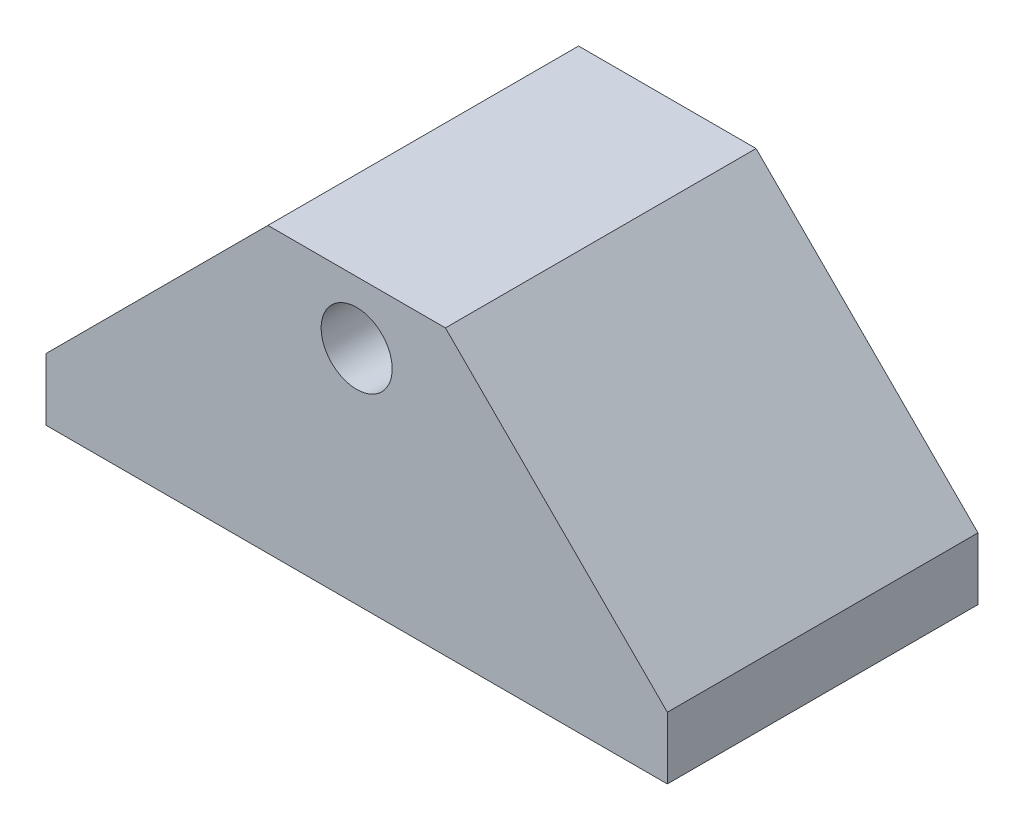
ISO-10303-21;
HEADER;
FILE_DESCRIPTION(('STEP AP214'),'2;1');
FILE_NAME('part.step','',(''),(''),'','','');
FILE_SCHEMA(('AUTOMOTIVE_DESIGN { 1 0 10303 214 1 1 1 1 }'));
ENDSEC;
DATA;
#1=APPLICATION_CONTEXT('core data for automotive mechanical design processes');
#2=APPLICATION_PROTOCOL_DEFINITION('international standard','automotive_design',2000,#1);
#3=PRODUCT_CONTEXT('',#1,'mechanical');
#4=PRODUCT('Part','Part','',(#3));
#5=PRODUCT_RELATED_PRODUCT_CATEGORY('part','',(#4));
#6=PRODUCT_DEFINITION_FORMATION('','',#4);
#7=PRODUCT_DEFINITION_CONTEXT('part definition',#1,'design');
#8=PRODUCT_DEFINITION('design','',#6,#7);
#9=PRODUCT_DEFINITION_SHAPE('','',#8);
#10=(LENGTH_UNIT() NAMED_UNIT(*) SI_UNIT(.MILLI.,.METRE.));
#11=(NAMED_UNIT(*) PLANE_ANGLE_UNIT() SI_UNIT($,.RADIAN.));
#12=(NAMED_UNIT(*) SI_UNIT($,.STERADIAN.) SOLID_ANGLE_UNIT());
#13=UNCERTAINTY_MEASURE_WITH_UNIT(LENGTH_MEASURE(1.E-05),#10,'distance_accuracy_value','');
#14=(GEOMETRIC_REPRESENTATION_CONTEXT(3) GLOBAL_UNCERTAINTY_ASSIGNED_CONTEXT((#13)) GLOBAL_UNIT_ASSIGNED_CONTEXT((#10,
#11,#12)) REPRESENTATION_CONTEXT('',''));
#15=CARTESIAN_POINT('',(0.,0.,0.));
#16=DIRECTION('',(0.,0.,1.));
#17=DIRECTION('',(1.,0.,0.));
#18=AXIS2_PLACEMENT_3D('',#15,#16,#17);
#19=CARTESIAN_POINT('',(35.,32.,17.5));
#20=DIRECTION('',(-1.,0.,0.));
#21=DIRECTION('',(0.,0.,1.));
#22=AXIS2_PLACEMENT_3D('',#19,#20,#21);
#23=PLANE('',#22);
#24=DIRECTION('',(0.,-1.,0.));
#25=VECTOR('',#24,1.);
#26=CARTESIAN_POINT('',(35.,32.,-17.5));
#27=LINE('',#26,#25);
#28=CARTESIAN_POINT('',(35.,6.9999999999999,-17.5));
#29=VERTEX_POINT('',#28);
#30=CARTESIAN_POINT('',(35.,0.,-17.5));
#31=VERTEX_POINT('',#30);
#32=EDGE_CURVE('E87',#29,#31,#27,.T.);
#33=ORIENTED_EDGE('',*,*,#32,.F.);
#34=DIRECTION('',(0.,0.,1.));
#35=VECTOR('',#34,1.);
#36=CARTESIAN_POINT('',(35.,6.9999999999999,17.5));
#37=LINE('',#36,#35);
#38=CARTESIAN_POINT('',(35.,6.9999999999999,17.5));
#39=VERTEX_POINT('',#38);
#40=EDGE_CURVE('E58',#29,#39,#37,.T.);
#41=ORIENTED_EDGE('',*,*,#40,.T.);
#42=DIRECTION('',(0.,-1.,0.));
#43=VECTOR('',#42,1.);
#44=CARTESIAN_POINT('',(35.,32.,17.5));
#45=LINE('',#44,#43);
#46=CARTESIAN_POINT('',(35.,0.,17.5));
#47=VERTEX_POINT('',#46);
#48=EDGE_CURVE('E107',#39,#47,#45,.T.);
#49=ORIENTED_EDGE('',*,*,#48,.T.);
#50=DIRECTION('',(0.,0.,-1.));
#51=VECTOR('',#50,1.);
#52=CARTESIAN_POINT('',(35.,0.,17.5));
#53=LINE('',#52,#51);
#54=EDGE_CURVE('E103',#47,#31,#53,.T.);
#55=ORIENTED_EDGE('',*,*,#54,.T.);
#56=EDGE_LOOP('',(#33,#41,#49,#55));
#57=FACE_BOUND('',#56,.T.);
#58=ADVANCED_FACE('F34',(#57),#23,.F.);
#59=CARTESIAN_POINT('',(-35.,32.,-17.5));
#60=DIRECTION('',(0.,0.,1.));
#61=DIRECTION('',(1.,0.,0.));
#62=AXIS2_PLACEMENT_3D('',#59,#60,#61);
#63=PLANE('',#62);
#64=CARTESIAN_POINT('',(0.,25.,-17.5));
#65=DIRECTION('',(0.,0.,1.));
#66=DIRECTION('',(1.,0.,0.));
#67=AXIS2_PLACEMENT_3D('',#64,#65,#66);
#68=CIRCLE('',#67,4.);
#69=CARTESIAN_POINT('',(4.,25.,-17.5));
#70=VERTEX_POINT('',#69);
#71=EDGE_CURVE('E109',#70,#70,#68,.T.);
#72=ORIENTED_EDGE('',*,*,#71,.T.);
#73=EDGE_LOOP('',(#72));
#74=FACE_BOUND('',#73,.T.);
#75=DIRECTION('',(-1.,0.,0.));
#76=VECTOR('',#75,1.);
#77=CARTESIAN_POINT('',(-35.,32.,-17.5));
#78=LINE('',#77,#76);
#79=CARTESIAN_POINT('',(9.99999999999999,32.,-17.5));
#80=VERTEX_POINT('',#79);
#81=CARTESIAN_POINT('',(-9.99999999999999,32.,-17.5));
#82=VERTEX_POINT('',#81);
#83=EDGE_CURVE('E121',#80,#82,#78,.T.);
#84=ORIENTED_EDGE('',*,*,#83,.F.);
#85=DIRECTION('',(-0.707106781186546,0.707106781186549,0.));
#86=VECTOR('',#85,1.);
#87=CARTESIAN_POINT('',(9.99999999999999,32.,-17.5));
#88=LINE('',#87,#86);
#89=EDGE_CURVE('E94',#80,#29,#88,.F.);
#90=ORIENTED_EDGE('',*,*,#89,.T.);
#91=ORIENTED_EDGE('',*,*,#32,.T.);
#92=DIRECTION('',(-1.,0.,0.));
#93=VECTOR('',#92,1.);
#94=CARTESIAN_POINT('',(-35.,0.,-17.5));
#95=LINE('',#94,#93);
#96=CARTESIAN_POINT('',(-35.,0.,-17.5));
#97=VERTEX_POINT('',#96);
#98=EDGE_CURVE('E92',#31,#97,#95,.T.);
#99=ORIENTED_EDGE('',*,*,#98,.T.);
#100=DIRECTION('',(0.,-1.,0.));
#101=VECTOR('',#100,1.);
#102=CARTESIAN_POINT('',(-35.,32.,-17.5));
#103=LINE('',#102,#101);
#104=CARTESIAN_POINT('',(-35.,6.9999999999999,-17.5));
#105=VERTEX_POINT('',#104);
#106=EDGE_CURVE('E97',#105,#97,#103,.T.);
#107=ORIENTED_EDGE('',*,*,#106,.F.);
#108=DIRECTION('',(-0.707106781186546,-0.707106781186549,0.));
#109=VECTOR('',#108,1.);
#110=CARTESIAN_POINT('',(-9.99999999999999,32.,-17.5));
#111=LINE('',#110,#109);
#112=EDGE_CURVE('E131',#105,#82,#111,.F.);
#113=ORIENTED_EDGE('',*,*,#112,.T.);
#114=EDGE_LOOP('',(#84,#90,#91,#99,#107,#113));
#115=FACE_BOUND('',#114,.T.);
#116=ADVANCED_FACE('F90',(#74,#115),#63,.F.);
#117=CARTESIAN_POINT('',(-35.,32.,17.5));
#118=DIRECTION('',(1.,0.,0.));
#119=DIRECTION('',(0.,0.,-1.));
#120=AXIS2_PLACEMENT_3D('',#117,#118,#119);
#121=PLANE('',#120);
#122=DIRECTION('',(0.,-1.,0.));
#123=VECTOR('',#122,1.);
#124=CARTESIAN_POINT('',(-35.,32.,17.5));
#125=LINE('',#124,#123);
#126=CARTESIAN_POINT('',(-35.,6.9999999999999,17.5));
#127=VERTEX_POINT('',#126);
#128=CARTESIAN_POINT('',(-35.,0.,17.5));
#129=VERTEX_POINT('',#128);
#130=EDGE_CURVE('E123',#127,#129,#125,.T.);
#131=ORIENTED_EDGE('',*,*,#130,.F.);
#132=DIRECTION('',(0.,0.,-1.));
#133=VECTOR('',#132,1.);
#134=CARTESIAN_POINT('',(-35.,6.9999999999999,17.5));
#135=LINE('',#134,#133);
#136=EDGE_CURVE('E11',#127,#105,#135,.T.);
#137=ORIENTED_EDGE('',*,*,#136,.T.);
#138=ORIENTED_EDGE('',*,*,#106,.T.);
#139=DIRECTION('',(0.,0.,1.));
#140=VECTOR('',#139,1.);
#141=CARTESIAN_POINT('',(-35.,0.,17.5));
#142=LINE('',#141,#140);
#143=EDGE_CURVE('E105',#97,#129,#142,.T.);
#144=ORIENTED_EDGE('',*,*,#143,.T.);
#145=EDGE_LOOP('',(#131,#137,#138,#144));
#146=FACE_BOUND('',#145,.T.);
#147=ADVANCED_FACE('F160',(#146),#121,.F.);
#148=CARTESIAN_POINT('',(-35.,32.,17.5));
#149=DIRECTION('',(0.,0.,-1.));
#150=DIRECTION('',(-1.,0.,0.));
#151=AXIS2_PLACEMENT_3D('',#148,#149,#150);
#152=PLANE('',#151);
#153=CARTESIAN_POINT('',(0.,25.,17.5));
#154=DIRECTION('',(0.,0.,1.));
#155=DIRECTION('',(1.,0.,0.));
#156=AXIS2_PLACEMENT_3D('',#153,#154,#155);
#157=CIRCLE('',#156,4.);
#158=CARTESIAN_POINT('',(4.,25.,17.5));
#159=VERTEX_POINT('',#158);
#160=EDGE_CURVE('E112',#159,#159,#157,.T.);
#161=ORIENTED_EDGE('',*,*,#160,.F.);
#162=EDGE_LOOP('',(#161));
#163=FACE_BOUND('',#162,.T.);
#164=ORIENTED_EDGE('',*,*,#48,.F.);
#165=DIRECTION('',(0.707106781186546,-0.707106781186549,0.));
#166=VECTOR('',#165,1.);
#167=CARTESIAN_POINT('',(9.99999999999999,32.,17.5));
#168=LINE('',#167,#166);
#169=CARTESIAN_POINT('',(9.99999999999999,32.,17.5));
#170=VERTEX_POINT('',#169);
#171=EDGE_CURVE('E43',#39,#170,#168,.F.);
#172=ORIENTED_EDGE('',*,*,#171,.T.);
#173=DIRECTION('',(1.,0.,0.));
#174=VECTOR('',#173,1.);
#175=CARTESIAN_POINT('',(-35.,32.,17.5));
#176=LINE('',#175,#174);
#177=CARTESIAN_POINT('',(-9.99999999999999,32.,17.5));
#178=VERTEX_POINT('',#177);
#179=EDGE_CURVE('E115',#178,#170,#176,.T.);
#180=ORIENTED_EDGE('',*,*,#179,.F.);
#181=DIRECTION('',(0.707106781186546,0.707106781186549,0.));
#182=VECTOR('',#181,1.);
#183=CARTESIAN_POINT('',(-9.99999999999999,32.,17.5));
#184=LINE('',#183,#182);
#185=EDGE_CURVE('E50',#178,#127,#184,.F.);
#186=ORIENTED_EDGE('',*,*,#185,.T.);
#187=ORIENTED_EDGE('',*,*,#130,.T.);
#188=DIRECTION('',(1.,0.,0.));
#189=VECTOR('',#188,1.);
#190=CARTESIAN_POINT('',(-35.,0.,17.5));
#191=LINE('',#190,#189);
#192=EDGE_CURVE('E119',#129,#47,#191,.T.);
#193=ORIENTED_EDGE('',*,*,#192,.T.);
#194=EDGE_LOOP('',(#164,#172,#180,#186,#187,#193));
#195=FACE_BOUND('',#194,.T.);
#196=ADVANCED_FACE('F137',(#163,#195),#152,.F.);
#197=CARTESIAN_POINT('',(0.,32.,0.));
#198=DIRECTION('',(0.,-1.,0.));
#199=DIRECTION('',(0.,0.,-1.));
#200=AXIS2_PLACEMENT_3D('',#197,#198,#199);
#201=PLANE('',#200);
#202=ORIENTED_EDGE('',*,*,#179,.T.);
#203=DIRECTION('',(0.,0.,-1.));
#204=VECTOR('',#203,1.);
#205=CARTESIAN_POINT('',(9.99999999999999,32.,0.));
#206=LINE('',#205,#204);
#207=EDGE_CURVE('E128',#170,#80,#206,.T.);
#208=ORIENTED_EDGE('',*,*,#207,.T.);
#209=ORIENTED_EDGE('',*,*,#83,.T.);
#210=DIRECTION('',(0.,0.,1.));
#211=VECTOR('',#210,1.);
#212=CARTESIAN_POINT('',(-9.99999999999999,32.,0.));
#213=LINE('',#212,#211);
#214=EDGE_CURVE('E96',#82,#178,#213,.T.);
#215=ORIENTED_EDGE('',*,*,#214,.T.);
#216=EDGE_LOOP('',(#202,#208,#209,#215));
#217=FACE_BOUND('',#216,.T.);
#218=ADVANCED_FACE('F141',(#217),#201,.F.);
#219=CARTESIAN_POINT('',(0.,0.,0.));
#220=DIRECTION('',(0.,-1.,0.));
#221=DIRECTION('',(0.,0.,-1.));
#222=AXIS2_PLACEMENT_3D('',#219,#220,#221);
#223=PLANE('',#222);
#224=ORIENTED_EDGE('',*,*,#54,.F.);
#225=ORIENTED_EDGE('',*,*,#192,.F.);
#226=ORIENTED_EDGE('',*,*,#143,.F.);
#227=ORIENTED_EDGE('',*,*,#98,.F.);
#228=EDGE_LOOP('',(#224,#225,#226,#227));
#229=FACE_BOUND('',#228,.T.);
#230=ADVANCED_FACE('F101',(#229),#223,.T.);
#231=CARTESIAN_POINT('',(0.,25.,-17.5));
#232=DIRECTION('',(0.,0.,1.));
#233=DIRECTION('',(1.,0.,0.));
#234=AXIS2_PLACEMENT_3D('',#231,#232,#233);
#235=CYLINDRICAL_SURFACE('',#234,4.);
#236=ORIENTED_EDGE('',*,*,#71,.F.);
#237=EDGE_LOOP('',(#236));
#238=FACE_BOUND('',#237,.T.);
#239=ORIENTED_EDGE('',*,*,#160,.T.);
#240=EDGE_LOOP('',(#239));
#241=FACE_BOUND('',#240,.T.);
#242=ADVANCED_FACE('F146',(#238,#241),#235,.F.);
#243=CARTESIAN_POINT('',(9.99999999999999,32.,0.));
#244=DIRECTION('',(-0.707106781186549,-0.707106781186546,0.));
#245=DIRECTION('',(0.,0.,-1.));
#246=AXIS2_PLACEMENT_3D('',#243,#244,#245);
#247=PLANE('',#246);
#248=ORIENTED_EDGE('',*,*,#171,.F.);
#249=ORIENTED_EDGE('',*,*,#40,.F.);
#250=ORIENTED_EDGE('',*,*,#89,.F.);
#251=ORIENTED_EDGE('',*,*,#207,.F.);
#252=EDGE_LOOP('',(#248,#249,#250,#251));
#253=FACE_BOUND('',#252,.T.);
#254=ADVANCED_FACE('F144',(#253),#247,.F.);
#255=CARTESIAN_POINT('',(-9.99999999999999,32.,0.));
#256=DIRECTION('',(0.707106781186549,-0.707106781186546,0.));
#257=DIRECTION('',(0.,0.,1.));
#258=AXIS2_PLACEMENT_3D('',#255,#256,#257);
#259=PLANE('',#258);
#260=ORIENTED_EDGE('',*,*,#112,.F.);
#261=ORIENTED_EDGE('',*,*,#136,.F.);
#262=ORIENTED_EDGE('',*,*,#185,.F.);
#263=ORIENTED_EDGE('',*,*,#214,.F.);
#264=EDGE_LOOP('',(#260,#261,#262,#263));
#265=FACE_BOUND('',#264,.T.);
#266=ADVANCED_FACE('F37',(#265),#259,.F.);
#267=CLOSED_SHELL('',(#58,#116,#147,#196,#218,#230,#242,#254,#266));
#268=MANIFOLD_SOLID_BREP('B2',#267);
#269=ADVANCED_BREP_SHAPE_REPRESENTATION('',(#18,#268),#14);
#270=SHAPE_DEFINITION_REPRESENTATION(#9,#269);
ENDSEC;
END-ISO-10303-21;
